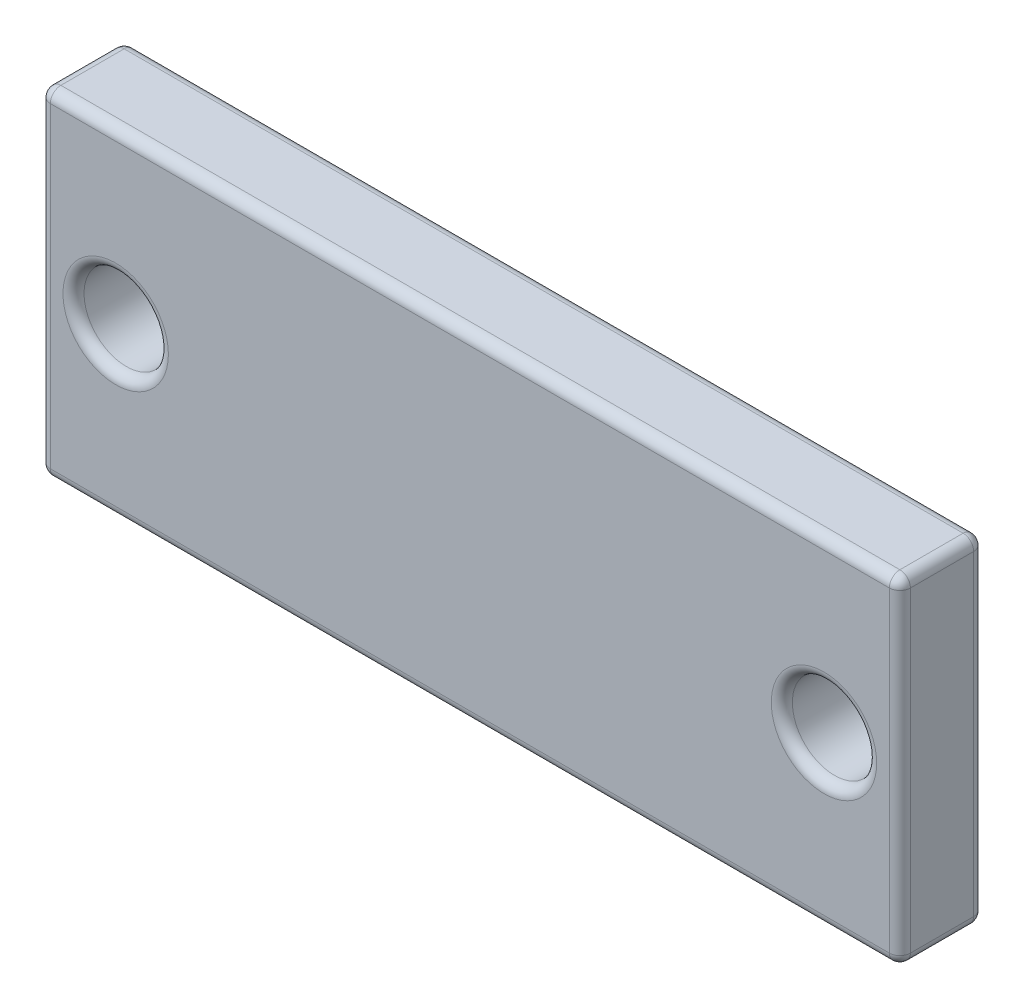
ISO-10303-21;
HEADER;
FILE_DESCRIPTION(('STEP AP214'),'2;1');
FILE_NAME('part.step','',(''),(''),'','','');
FILE_SCHEMA(('AUTOMOTIVE_DESIGN { 1 0 10303 214 1 1 1 1 }'));
ENDSEC;
DATA;
#1=APPLICATION_CONTEXT('core data for automotive mechanical design processes');
#2=APPLICATION_PROTOCOL_DEFINITION('international standard','automotive_design',2000,#1);
#3=PRODUCT_CONTEXT('',#1,'mechanical');
#4=PRODUCT('Part','Part','',(#3));
#5=PRODUCT_RELATED_PRODUCT_CATEGORY('part','',(#4));
#6=PRODUCT_DEFINITION_FORMATION('','',#4);
#7=PRODUCT_DEFINITION_CONTEXT('part definition',#1,'design');
#8=PRODUCT_DEFINITION('design','',#6,#7);
#9=PRODUCT_DEFINITION_SHAPE('','',#8);
#10=(LENGTH_UNIT() NAMED_UNIT(*) SI_UNIT(.MILLI.,.METRE.));
#11=(NAMED_UNIT(*) PLANE_ANGLE_UNIT() SI_UNIT($,.RADIAN.));
#12=(NAMED_UNIT(*) SI_UNIT($,.STERADIAN.) SOLID_ANGLE_UNIT());
#13=UNCERTAINTY_MEASURE_WITH_UNIT(LENGTH_MEASURE(1.E-05),#10,'distance_accuracy_value','');
#14=(GEOMETRIC_REPRESENTATION_CONTEXT(3) GLOBAL_UNCERTAINTY_ASSIGNED_CONTEXT((#13)) GLOBAL_UNIT_ASSIGNED_CONTEXT((#10,
#11,#12)) REPRESENTATION_CONTEXT('',''));
#15=CARTESIAN_POINT('',(0.,0.,0.));
#16=DIRECTION('',(0.,0.,1.));
#17=DIRECTION('',(1.,0.,0.));
#18=AXIS2_PLACEMENT_3D('',#15,#16,#17);
#19=CARTESIAN_POINT('',(-32.385,152.4,29.43225));
#20=DIRECTION('',(1.,0.,0.));
#21=DIRECTION('',(0.,0.,-1.));
#22=AXIS2_PLACEMENT_3D('',#19,#20,#21);
#23=PLANE('',#22);
#24=DIRECTION('',(0.,0.,-1.));
#25=VECTOR('',#24,1.);
#26=CARTESIAN_POINT('',(-32.385,151.60625,29.43225));
#27=LINE('',#26,#25);
#28=CARTESIAN_POINT('',(-32.385,151.60625,28.6385));
#29=VERTEX_POINT('',#28);
#30=CARTESIAN_POINT('',(-32.385,151.60625,23.876));
#31=VERTEX_POINT('',#30);
#32=EDGE_CURVE('E199',#29,#31,#27,.T.);
#33=ORIENTED_EDGE('',*,*,#32,.T.);
#34=DIRECTION('',(0.,-1.,0.));
#35=VECTOR('',#34,1.);
#36=CARTESIAN_POINT('',(-32.385,152.4,23.876));
#37=LINE('',#36,#35);
#38=CARTESIAN_POINT('',(-32.385,127.79375,23.876));
#39=VERTEX_POINT('',#38);
#40=EDGE_CURVE('E134',#31,#39,#37,.T.);
#41=ORIENTED_EDGE('',*,*,#40,.T.);
#42=DIRECTION('',(0.,0.,-1.));
#43=VECTOR('',#42,1.);
#44=CARTESIAN_POINT('',(-32.385,127.79375,29.43225));
#45=LINE('',#44,#43);
#46=CARTESIAN_POINT('',(-32.385,127.79375,28.6385));
#47=VERTEX_POINT('',#46);
#48=EDGE_CURVE('E197',#39,#47,#45,.F.);
#49=ORIENTED_EDGE('',*,*,#48,.T.);
#50=DIRECTION('',(0.,-1.,0.));
#51=VECTOR('',#50,1.);
#52=CARTESIAN_POINT('',(-32.385,152.4,28.6385));
#53=LINE('',#52,#51);
#54=EDGE_CURVE('E195',#47,#29,#53,.F.);
#55=ORIENTED_EDGE('',*,*,#54,.T.);
#56=EDGE_LOOP('',(#33,#41,#49,#55));
#57=FACE_BOUND('',#56,.T.);
#58=ADVANCED_FACE('F36',(#57),#23,.F.);
#59=CARTESIAN_POINT('',(-32.385,127.,29.43225));
#60=DIRECTION('',(0.,1.,0.));
#61=DIRECTION('',(0.,0.,1.));
#62=AXIS2_PLACEMENT_3D('',#59,#60,#61);
#63=PLANE('',#62);
#64=DIRECTION('',(1.,0.,0.));
#65=VECTOR('',#64,1.);
#66=CARTESIAN_POINT('',(-32.385,127.,23.876));
#67=LINE('',#66,#65);
#68=CARTESIAN_POINT('',(-31.59125,127.,23.876));
#69=VERTEX_POINT('',#68);
#70=CARTESIAN_POINT('',(31.59125,127.,23.876));
#71=VERTEX_POINT('',#70);
#72=EDGE_CURVE('E206',#69,#71,#67,.T.);
#73=ORIENTED_EDGE('',*,*,#72,.T.);
#74=DIRECTION('',(0.,0.,-1.));
#75=VECTOR('',#74,1.);
#76=CARTESIAN_POINT('',(31.59125,127.,29.43225));
#77=LINE('',#76,#75);
#78=CARTESIAN_POINT('',(31.59125,127.,28.6385));
#79=VERTEX_POINT('',#78);
#80=EDGE_CURVE('E209',#71,#79,#77,.F.);
#81=ORIENTED_EDGE('',*,*,#80,.T.);
#82=DIRECTION('',(1.,0.,0.));
#83=VECTOR('',#82,1.);
#84=CARTESIAN_POINT('',(-32.385,127.,28.6385));
#85=LINE('',#84,#83);
#86=CARTESIAN_POINT('',(-31.59125,127.,28.6385));
#87=VERTEX_POINT('',#86);
#88=EDGE_CURVE('E204',#79,#87,#85,.F.);
#89=ORIENTED_EDGE('',*,*,#88,.T.);
#90=DIRECTION('',(0.,0.,-1.));
#91=VECTOR('',#90,1.);
#92=CARTESIAN_POINT('',(-31.59125,127.,29.43225));
#93=LINE('',#92,#91);
#94=EDGE_CURVE('E202',#87,#69,#93,.T.);
#95=ORIENTED_EDGE('',*,*,#94,.T.);
#96=EDGE_LOOP('',(#73,#81,#89,#95));
#97=FACE_BOUND('',#96,.T.);
#98=ADVANCED_FACE('F343',(#97),#63,.F.);
#99=CARTESIAN_POINT('',(32.385,127.,29.43225));
#100=DIRECTION('',(-1.,0.,0.));
#101=DIRECTION('',(0.,0.,1.));
#102=AXIS2_PLACEMENT_3D('',#99,#100,#101);
#103=PLANE('',#102);
#104=DIRECTION('',(0.,1.,0.));
#105=VECTOR('',#104,1.);
#106=CARTESIAN_POINT('',(32.385,127.,23.876));
#107=LINE('',#106,#105);
#108=CARTESIAN_POINT('',(32.385,127.79375,23.876));
#109=VERTEX_POINT('',#108);
#110=CARTESIAN_POINT('',(32.385,151.60625,23.876));
#111=VERTEX_POINT('',#110);
#112=EDGE_CURVE('E215',#109,#111,#107,.T.);
#113=ORIENTED_EDGE('',*,*,#112,.T.);
#114=DIRECTION('',(0.,0.,-1.));
#115=VECTOR('',#114,1.);
#116=CARTESIAN_POINT('',(32.385,151.60625,29.43225));
#117=LINE('',#116,#115);
#118=CARTESIAN_POINT('',(32.385,151.60625,28.6385));
#119=VERTEX_POINT('',#118);
#120=EDGE_CURVE('E218',#111,#119,#117,.F.);
#121=ORIENTED_EDGE('',*,*,#120,.T.);
#122=DIRECTION('',(0.,1.,0.));
#123=VECTOR('',#122,1.);
#124=CARTESIAN_POINT('',(32.385,127.,28.6385));
#125=LINE('',#124,#123);
#126=CARTESIAN_POINT('',(32.385,127.79375,28.6385));
#127=VERTEX_POINT('',#126);
#128=EDGE_CURVE('E213',#119,#127,#125,.F.);
#129=ORIENTED_EDGE('',*,*,#128,.T.);
#130=DIRECTION('',(0.,0.,-1.));
#131=VECTOR('',#130,1.);
#132=CARTESIAN_POINT('',(32.385,127.79375,29.43225));
#133=LINE('',#132,#131);
#134=EDGE_CURVE('E211',#127,#109,#133,.T.);
#135=ORIENTED_EDGE('',*,*,#134,.T.);
#136=EDGE_LOOP('',(#113,#121,#129,#135));
#137=FACE_BOUND('',#136,.T.);
#138=ADVANCED_FACE('F324',(#137),#103,.F.);
#139=CARTESIAN_POINT('',(32.385,152.4,29.43225));
#140=DIRECTION('',(0.,-1.,0.));
#141=DIRECTION('',(0.,0.,-1.));
#142=AXIS2_PLACEMENT_3D('',#139,#140,#141);
#143=PLANE('',#142);
#144=DIRECTION('',(-1.,0.,0.));
#145=VECTOR('',#144,1.);
#146=CARTESIAN_POINT('',(32.385,152.4,23.876));
#147=LINE('',#146,#145);
#148=CARTESIAN_POINT('',(31.59125,152.4,23.876));
#149=VERTEX_POINT('',#148);
#150=CARTESIAN_POINT('',(-31.59125,152.4,23.876));
#151=VERTEX_POINT('',#150);
#152=EDGE_CURVE('E45',#149,#151,#147,.T.);
#153=ORIENTED_EDGE('',*,*,#152,.T.);
#154=DIRECTION('',(0.,0.,-1.));
#155=VECTOR('',#154,1.);
#156=CARTESIAN_POINT('',(-31.59125,152.4,29.43225));
#157=LINE('',#156,#155);
#158=CARTESIAN_POINT('',(-31.59125,152.4,28.6385));
#159=VERTEX_POINT('',#158);
#160=EDGE_CURVE('E11',#151,#159,#157,.F.);
#161=ORIENTED_EDGE('',*,*,#160,.T.);
#162=DIRECTION('',(-1.,0.,0.));
#163=VECTOR('',#162,1.);
#164=CARTESIAN_POINT('',(32.385,152.4,28.6385));
#165=LINE('',#164,#163);
#166=CARTESIAN_POINT('',(31.59125,152.4,28.6385));
#167=VERTEX_POINT('',#166);
#168=EDGE_CURVE('E222',#159,#167,#165,.F.);
#169=ORIENTED_EDGE('',*,*,#168,.T.);
#170=DIRECTION('',(0.,0.,-1.));
#171=VECTOR('',#170,1.);
#172=CARTESIAN_POINT('',(31.59125,152.4,29.43225));
#173=LINE('',#172,#171);
#174=EDGE_CURVE('E220',#167,#149,#173,.T.);
#175=ORIENTED_EDGE('',*,*,#174,.T.);
#176=EDGE_LOOP('',(#153,#161,#169,#175));
#177=FACE_BOUND('',#176,.T.);
#178=ADVANCED_FACE('F294',(#177),#143,.F.);
#179=CARTESIAN_POINT('',(0.,0.,29.43225));
#180=DIRECTION('',(0.,0.,1.));
#181=DIRECTION('',(1.,0.,0.));
#182=AXIS2_PLACEMENT_3D('',#179,#180,#181);
#183=PLANE('',#182);
#184=CARTESIAN_POINT('',(-26.67,139.7,29.43225));
#185=DIRECTION('',(0.,0.,1.));
#186=DIRECTION('',(1.,0.,0.));
#187=AXIS2_PLACEMENT_3D('',#184,#185,#186);
#188=CIRCLE('',#187,3.96875);
#189=CARTESIAN_POINT('',(-22.70125,139.7,29.43225));
#190=VERTEX_POINT('',#189);
#191=EDGE_CURVE('E186',#190,#190,#188,.F.);
#192=ORIENTED_EDGE('',*,*,#191,.T.);
#193=EDGE_LOOP('',(#192));
#194=FACE_BOUND('',#193,.T.);
#195=CARTESIAN_POINT('',(26.67,139.7,29.43225));
#196=DIRECTION('',(0.,0.,1.));
#197=DIRECTION('',(1.,0.,0.));
#198=AXIS2_PLACEMENT_3D('',#195,#196,#197);
#199=CIRCLE('',#198,3.96875);
#200=CARTESIAN_POINT('',(30.63875,139.7,29.43225));
#201=VERTEX_POINT('',#200);
#202=EDGE_CURVE('E183',#201,#201,#199,.F.);
#203=ORIENTED_EDGE('',*,*,#202,.T.);
#204=EDGE_LOOP('',(#203));
#205=FACE_BOUND('',#204,.T.);
#206=DIRECTION('',(0.,-1.,0.));
#207=VECTOR('',#206,1.);
#208=CARTESIAN_POINT('',(-31.59125,127.,29.43225));
#209=LINE('',#208,#207);
#210=CARTESIAN_POINT('',(-31.59125,151.60625,29.43225));
#211=VERTEX_POINT('',#210);
#212=CARTESIAN_POINT('',(-31.59125,127.79375,29.43225));
#213=VERTEX_POINT('',#212);
#214=EDGE_CURVE('E174',#211,#213,#209,.T.);
#215=ORIENTED_EDGE('',*,*,#214,.T.);
#216=DIRECTION('',(1.,0.,0.));
#217=VECTOR('',#216,1.);
#218=CARTESIAN_POINT('',(32.385,127.79375,29.43225));
#219=LINE('',#218,#217);
#220=CARTESIAN_POINT('',(31.59125,127.79375,29.43225));
#221=VERTEX_POINT('',#220);
#222=EDGE_CURVE('E180',#213,#221,#219,.T.);
#223=ORIENTED_EDGE('',*,*,#222,.T.);
#224=DIRECTION('',(0.,1.,0.));
#225=VECTOR('',#224,1.);
#226=CARTESIAN_POINT('',(31.59125,152.4,29.43225));
#227=LINE('',#226,#225);
#228=CARTESIAN_POINT('',(31.59125,151.60625,29.43225));
#229=VERTEX_POINT('',#228);
#230=EDGE_CURVE('E178',#221,#229,#227,.T.);
#231=ORIENTED_EDGE('',*,*,#230,.T.);
#232=DIRECTION('',(-1.,0.,0.));
#233=VECTOR('',#232,1.);
#234=CARTESIAN_POINT('',(-32.385,151.60625,29.43225));
#235=LINE('',#234,#233);
#236=EDGE_CURVE('E176',#229,#211,#235,.T.);
#237=ORIENTED_EDGE('',*,*,#236,.T.);
#238=EDGE_LOOP('',(#215,#223,#231,#237));
#239=FACE_BOUND('',#238,.T.);
#240=ADVANCED_FACE('F300',(#194,#205,#239),#183,.T.);
#241=CARTESIAN_POINT('',(0.,0.,23.08225));
#242=DIRECTION('',(0.,0.,1.));
#243=DIRECTION('',(1.,0.,0.));
#244=AXIS2_PLACEMENT_3D('',#241,#242,#243);
#245=PLANE('',#244);
#246=CARTESIAN_POINT('',(-26.67,139.7,23.08225));
#247=DIRECTION('',(0.,0.,1.));
#248=DIRECTION('',(1.,0.,0.));
#249=AXIS2_PLACEMENT_3D('',#246,#247,#248);
#250=CIRCLE('',#249,3.96875);
#251=CARTESIAN_POINT('',(-22.70125,139.7,23.08225));
#252=VERTEX_POINT('',#251);
#253=EDGE_CURVE('E161',#252,#252,#250,.T.);
#254=ORIENTED_EDGE('',*,*,#253,.T.);
#255=EDGE_LOOP('',(#254));
#256=FACE_BOUND('',#255,.T.);
#257=CARTESIAN_POINT('',(26.67,139.7,23.08225));
#258=DIRECTION('',(0.,0.,1.));
#259=DIRECTION('',(1.,0.,0.));
#260=AXIS2_PLACEMENT_3D('',#257,#258,#259);
#261=CIRCLE('',#260,3.96875);
#262=CARTESIAN_POINT('',(30.63875,139.7,23.08225));
#263=VERTEX_POINT('',#262);
#264=EDGE_CURVE('E158',#263,#263,#261,.T.);
#265=ORIENTED_EDGE('',*,*,#264,.T.);
#266=EDGE_LOOP('',(#265));
#267=FACE_BOUND('',#266,.T.);
#268=DIRECTION('',(1.,0.,0.));
#269=VECTOR('',#268,1.);
#270=CARTESIAN_POINT('',(0.,127.79375,23.08225));
#271=LINE('',#270,#269);
#272=CARTESIAN_POINT('',(31.59125,127.79375,23.08225));
#273=VERTEX_POINT('',#272);
#274=CARTESIAN_POINT('',(-31.59125,127.79375,23.08225));
#275=VERTEX_POINT('',#274);
#276=EDGE_CURVE('E156',#273,#275,#271,.F.);
#277=ORIENTED_EDGE('',*,*,#276,.T.);
#278=DIRECTION('',(0.,-1.,0.));
#279=VECTOR('',#278,1.);
#280=CARTESIAN_POINT('',(-31.59125,0.,23.08225));
#281=LINE('',#280,#279);
#282=CARTESIAN_POINT('',(-31.59125,151.60625,23.08225));
#283=VERTEX_POINT('',#282);
#284=EDGE_CURVE('E131',#275,#283,#281,.F.);
#285=ORIENTED_EDGE('',*,*,#284,.T.);
#286=DIRECTION('',(-1.,0.,0.));
#287=VECTOR('',#286,1.);
#288=CARTESIAN_POINT('',(0.,151.60625,23.08225));
#289=LINE('',#288,#287);
#290=CARTESIAN_POINT('',(31.59125,151.60625,23.08225));
#291=VERTEX_POINT('',#290);
#292=EDGE_CURVE('E146',#283,#291,#289,.F.);
#293=ORIENTED_EDGE('',*,*,#292,.T.);
#294=DIRECTION('',(0.,1.,0.));
#295=VECTOR('',#294,1.);
#296=CARTESIAN_POINT('',(31.59125,0.,23.08225));
#297=LINE('',#296,#295);
#298=EDGE_CURVE('E152',#291,#273,#297,.F.);
#299=ORIENTED_EDGE('',*,*,#298,.T.);
#300=EDGE_LOOP('',(#277,#285,#293,#299));
#301=FACE_BOUND('',#300,.T.);
#302=ADVANCED_FACE('F154',(#256,#267,#301),#245,.F.);
#303=CARTESIAN_POINT('',(-26.67,139.7,31.75));
#304=DIRECTION('',(0.,0.,-1.));
#305=DIRECTION('',(-1.,0.,0.));
#306=AXIS2_PLACEMENT_3D('',#303,#304,#305);
#307=CYLINDRICAL_SURFACE('',#306,3.175);
#308=CARTESIAN_POINT('',(-26.67,139.7,23.876));
#309=DIRECTION('',(0.,0.,1.));
#310=DIRECTION('',(1.,0.,0.));
#311=AXIS2_PLACEMENT_3D('',#308,#309,#310);
#312=CIRCLE('',#311,3.175);
#313=CARTESIAN_POINT('',(-23.495,139.7,23.876));
#314=VERTEX_POINT('',#313);
#315=EDGE_CURVE('E171',#314,#314,#312,.F.);
#316=ORIENTED_EDGE('',*,*,#315,.T.);
#317=EDGE_LOOP('',(#316));
#318=FACE_BOUND('',#317,.T.);
#319=CARTESIAN_POINT('',(-26.67,139.7,28.6385));
#320=DIRECTION('',(0.,0.,1.));
#321=DIRECTION('',(1.,0.,0.));
#322=AXIS2_PLACEMENT_3D('',#319,#320,#321);
#323=CIRCLE('',#322,3.175);
#324=CARTESIAN_POINT('',(-23.495,139.7,28.6385));
#325=VERTEX_POINT('',#324);
#326=EDGE_CURVE('E168',#325,#325,#323,.T.);
#327=ORIENTED_EDGE('',*,*,#326,.T.);
#328=EDGE_LOOP('',(#327));
#329=FACE_BOUND('',#328,.T.);
#330=ADVANCED_FACE('F517',(#318,#329),#307,.F.);
#331=CARTESIAN_POINT('',(26.67,139.7,31.75));
#332=DIRECTION('',(0.,0.,-1.));
#333=DIRECTION('',(-1.,0.,0.));
#334=AXIS2_PLACEMENT_3D('',#331,#332,#333);
#335=CYLINDRICAL_SURFACE('',#334,3.175);
#336=CARTESIAN_POINT('',(26.67,139.7,23.876));
#337=DIRECTION('',(0.,0.,1.));
#338=DIRECTION('',(1.,0.,0.));
#339=AXIS2_PLACEMENT_3D('',#336,#337,#338);
#340=CIRCLE('',#339,3.175);
#341=CARTESIAN_POINT('',(29.845,139.7,23.876));
#342=VERTEX_POINT('',#341);
#343=EDGE_CURVE('E192',#342,#342,#340,.F.);
#344=ORIENTED_EDGE('',*,*,#343,.T.);
#345=EDGE_LOOP('',(#344));
#346=FACE_BOUND('',#345,.T.);
#347=CARTESIAN_POINT('',(26.67,139.7,28.6385));
#348=DIRECTION('',(0.,0.,1.));
#349=DIRECTION('',(1.,0.,0.));
#350=AXIS2_PLACEMENT_3D('',#347,#348,#349);
#351=CIRCLE('',#350,3.175);
#352=CARTESIAN_POINT('',(29.845,139.7,28.6385));
#353=VERTEX_POINT('',#352);
#354=EDGE_CURVE('E189',#353,#353,#351,.T.);
#355=ORIENTED_EDGE('',*,*,#354,.T.);
#356=EDGE_LOOP('',(#355));
#357=FACE_BOUND('',#356,.T.);
#358=ADVANCED_FACE('F357',(#346,#357),#335,.F.);
#359=CARTESIAN_POINT('',(-26.67,139.7,23.876));
#360=DIRECTION('',(0.,0.,1.));
#361=DIRECTION('',(1.,0.,0.));
#362=AXIS2_PLACEMENT_3D('',#359,#360,#361);
#363=TOROIDAL_SURFACE('',#362,3.96875,0.79375);
#364=ORIENTED_EDGE('',*,*,#315,.F.);
#365=EDGE_LOOP('',(#364));
#366=FACE_BOUND('',#365,.T.);
#367=ORIENTED_EDGE('',*,*,#253,.F.);
#368=EDGE_LOOP('',(#367));
#369=FACE_BOUND('',#368,.T.);
#370=ADVANCED_FACE('F353',(#366,#369),#363,.T.);
#371=CARTESIAN_POINT('',(-26.67,139.7,28.6385));
#372=DIRECTION('',(0.,0.,1.));
#373=DIRECTION('',(1.,0.,0.));
#374=AXIS2_PLACEMENT_3D('',#371,#372,#373);
#375=TOROIDAL_SURFACE('',#374,3.96875,0.79375);
#376=ORIENTED_EDGE('',*,*,#191,.F.);
#377=EDGE_LOOP('',(#376));
#378=FACE_BOUND('',#377,.T.);
#379=ORIENTED_EDGE('',*,*,#326,.F.);
#380=EDGE_LOOP('',(#379));
#381=FACE_BOUND('',#380,.T.);
#382=ADVANCED_FACE('F356',(#378,#381),#375,.T.);
#383=CARTESIAN_POINT('',(26.67,139.7,23.876));
#384=DIRECTION('',(0.,0.,1.));
#385=DIRECTION('',(1.,0.,0.));
#386=AXIS2_PLACEMENT_3D('',#383,#384,#385);
#387=TOROIDAL_SURFACE('',#386,3.96875,0.79375);
#388=ORIENTED_EDGE('',*,*,#343,.F.);
#389=EDGE_LOOP('',(#388));
#390=FACE_BOUND('',#389,.T.);
#391=ORIENTED_EDGE('',*,*,#264,.F.);
#392=EDGE_LOOP('',(#391));
#393=FACE_BOUND('',#392,.T.);
#394=ADVANCED_FACE('F361',(#390,#393),#387,.T.);
#395=CARTESIAN_POINT('',(26.67,139.7,28.6385));
#396=DIRECTION('',(0.,0.,1.));
#397=DIRECTION('',(1.,0.,0.));
#398=AXIS2_PLACEMENT_3D('',#395,#396,#397);
#399=TOROIDAL_SURFACE('',#398,3.96875,0.79375);
#400=ORIENTED_EDGE('',*,*,#202,.F.);
#401=EDGE_LOOP('',(#400));
#402=FACE_BOUND('',#401,.T.);
#403=ORIENTED_EDGE('',*,*,#354,.F.);
#404=EDGE_LOOP('',(#403));
#405=FACE_BOUND('',#404,.T.);
#406=ADVANCED_FACE('F365',(#402,#405),#399,.T.);
#407=CARTESIAN_POINT('',(31.59125,0.,28.6385));
#408=DIRECTION('',(0.,-1.,0.));
#409=DIRECTION('',(0.,0.,-1.));
#410=AXIS2_PLACEMENT_3D('',#407,#408,#409);
#411=CYLINDRICAL_SURFACE('',#410,0.79375);
#412=CARTESIAN_POINT('',(31.59125,151.60625,28.6385));
#413=DIRECTION('',(0.,1.,0.));
#414=DIRECTION('',(0.,0.,1.));
#415=AXIS2_PLACEMENT_3D('',#412,#413,#414);
#416=CIRCLE('',#415,0.79375);
#417=EDGE_CURVE('E40',#229,#119,#416,.T.);
#418=ORIENTED_EDGE('',*,*,#417,.F.);
#419=ORIENTED_EDGE('',*,*,#230,.F.);
#420=CARTESIAN_POINT('',(31.59125,127.79375,28.6385));
#421=DIRECTION('',(0.,-1.,0.));
#422=DIRECTION('',(0.,0.,-1.));
#423=AXIS2_PLACEMENT_3D('',#420,#421,#422);
#424=CIRCLE('',#423,0.79375);
#425=EDGE_CURVE('E273',#127,#221,#424,.T.);
#426=ORIENTED_EDGE('',*,*,#425,.F.);
#427=ORIENTED_EDGE('',*,*,#128,.F.);
#428=EDGE_LOOP('',(#418,#419,#426,#427));
#429=FACE_BOUND('',#428,.T.);
#430=ADVANCED_FACE('F38',(#429),#411,.T.);
#431=CARTESIAN_POINT('',(31.59125,151.60625,28.6385));
#432=DIRECTION('',(1.,0.,0.));
#433=DIRECTION('',(0.,0.,-1.));
#434=AXIS2_PLACEMENT_3D('',#431,#432,#433);
#435=SPHERICAL_SURFACE('',#434,0.79375);
#436=CARTESIAN_POINT('',(31.59125,151.60625,28.6385));
#437=DIRECTION('',(1.,0.,0.));
#438=DIRECTION('',(0.,0.,-1.));
#439=AXIS2_PLACEMENT_3D('',#436,#437,#438);
#440=CIRCLE('',#439,0.79375);
#441=EDGE_CURVE('E268',#229,#167,#440,.F.);
#442=ORIENTED_EDGE('',*,*,#441,.F.);
#443=ORIENTED_EDGE('',*,*,#417,.T.);
#444=CARTESIAN_POINT('',(31.59125,151.60625,28.6385));
#445=DIRECTION('',(0.,0.,1.));
#446=DIRECTION('',(1.,0.,0.));
#447=AXIS2_PLACEMENT_3D('',#444,#445,#446);
#448=CIRCLE('',#447,0.79375);
#449=EDGE_CURVE('E271',#167,#119,#448,.F.);
#450=ORIENTED_EDGE('',*,*,#449,.F.);
#451=EDGE_LOOP('',(#442,#443,#450));
#452=FACE_BOUND('',#451,.T.);
#453=ADVANCED_FACE('F285',(#452),#435,.T.);
#454=CARTESIAN_POINT('',(31.59125,127.79375,28.6385));
#455=DIRECTION('',(0.,0.,1.));
#456=DIRECTION('',(1.,0.,0.));
#457=AXIS2_PLACEMENT_3D('',#454,#455,#456);
#458=SPHERICAL_SURFACE('',#457,0.79375);
#459=CARTESIAN_POINT('',(31.59125,127.79375,28.6385));
#460=DIRECTION('',(0.,0.,1.));
#461=DIRECTION('',(1.,0.,0.));
#462=AXIS2_PLACEMENT_3D('',#459,#460,#461);
#463=CIRCLE('',#462,0.79375);
#464=EDGE_CURVE('E263',#127,#79,#463,.F.);
#465=ORIENTED_EDGE('',*,*,#464,.F.);
#466=ORIENTED_EDGE('',*,*,#425,.T.);
#467=CARTESIAN_POINT('',(31.59125,127.79375,28.6385));
#468=DIRECTION('',(1.,0.,0.));
#469=DIRECTION('',(0.,0.,-1.));
#470=AXIS2_PLACEMENT_3D('',#467,#468,#469);
#471=CIRCLE('',#470,0.79375);
#472=EDGE_CURVE('E266',#79,#221,#471,.F.);
#473=ORIENTED_EDGE('',*,*,#472,.F.);
#474=EDGE_LOOP('',(#465,#466,#473));
#475=FACE_BOUND('',#474,.T.);
#476=ADVANCED_FACE('F316',(#475),#458,.T.);
#477=CARTESIAN_POINT('',(31.59125,151.60625,29.43225));
#478=DIRECTION('',(0.,0.,-1.));
#479=DIRECTION('',(-1.,0.,0.));
#480=AXIS2_PLACEMENT_3D('',#477,#478,#479);
#481=CYLINDRICAL_SURFACE('',#480,0.79375);
#482=ORIENTED_EDGE('',*,*,#449,.T.);
#483=ORIENTED_EDGE('',*,*,#120,.F.);
#484=CARTESIAN_POINT('',(31.59125,151.60625,23.876));
#485=DIRECTION('',(0.,0.,-1.));
#486=DIRECTION('',(-1.,0.,0.));
#487=AXIS2_PLACEMENT_3D('',#484,#485,#486);
#488=CIRCLE('',#487,0.79375);
#489=EDGE_CURVE('E258',#149,#111,#488,.T.);
#490=ORIENTED_EDGE('',*,*,#489,.F.);
#491=ORIENTED_EDGE('',*,*,#174,.F.);
#492=EDGE_LOOP('',(#482,#483,#490,#491));
#493=FACE_BOUND('',#492,.T.);
#494=ADVANCED_FACE('F292',(#493),#481,.T.);
#495=CARTESIAN_POINT('',(0.,151.60625,28.6385));
#496=DIRECTION('',(1.,0.,0.));
#497=DIRECTION('',(0.,0.,-1.));
#498=AXIS2_PLACEMENT_3D('',#495,#496,#497);
#499=CYLINDRICAL_SURFACE('',#498,0.79375);
#500=ORIENTED_EDGE('',*,*,#441,.T.);
#501=ORIENTED_EDGE('',*,*,#168,.F.);
#502=CARTESIAN_POINT('',(-31.59125,151.60625,28.6385));
#503=DIRECTION('',(-1.,0.,0.));
#504=DIRECTION('',(0.,0.,1.));
#505=AXIS2_PLACEMENT_3D('',#502,#503,#504);
#506=CIRCLE('',#505,0.79375);
#507=EDGE_CURVE('E255',#211,#159,#506,.T.);
#508=ORIENTED_EDGE('',*,*,#507,.F.);
#509=ORIENTED_EDGE('',*,*,#236,.F.);
#510=EDGE_LOOP('',(#500,#501,#508,#509));
#511=FACE_BOUND('',#510,.T.);
#512=ADVANCED_FACE('F297',(#511),#499,.T.);
#513=CARTESIAN_POINT('',(-31.59125,0.,28.6385));
#514=DIRECTION('',(0.,1.,0.));
#515=DIRECTION('',(0.,0.,1.));
#516=AXIS2_PLACEMENT_3D('',#513,#514,#515);
#517=CYLINDRICAL_SURFACE('',#516,0.79375);
#518=CARTESIAN_POINT('',(-31.59125,127.79375,28.6385));
#519=DIRECTION('',(0.,-1.,0.));
#520=DIRECTION('',(0.,0.,-1.));
#521=AXIS2_PLACEMENT_3D('',#518,#519,#520);
#522=CIRCLE('',#521,0.79375);
#523=EDGE_CURVE('E249',#213,#47,#522,.T.);
#524=ORIENTED_EDGE('',*,*,#523,.F.);
#525=ORIENTED_EDGE('',*,*,#214,.F.);
#526=CARTESIAN_POINT('',(-31.59125,151.60625,28.6385));
#527=DIRECTION('',(0.,1.,0.));
#528=DIRECTION('',(0.,0.,1.));
#529=AXIS2_PLACEMENT_3D('',#526,#527,#528);
#530=CIRCLE('',#529,0.79375);
#531=EDGE_CURVE('E252',#29,#211,#530,.T.);
#532=ORIENTED_EDGE('',*,*,#531,.F.);
#533=ORIENTED_EDGE('',*,*,#54,.F.);
#534=EDGE_LOOP('',(#524,#525,#532,#533));
#535=FACE_BOUND('',#534,.T.);
#536=ADVANCED_FACE('F305',(#535),#517,.T.);
#537=CARTESIAN_POINT('',(0.,127.79375,28.6385));
#538=DIRECTION('',(-1.,0.,0.));
#539=DIRECTION('',(0.,0.,1.));
#540=AXIS2_PLACEMENT_3D('',#537,#538,#539);
#541=CYLINDRICAL_SURFACE('',#540,0.79375);
#542=ORIENTED_EDGE('',*,*,#472,.T.);
#543=ORIENTED_EDGE('',*,*,#222,.F.);
#544=CARTESIAN_POINT('',(-31.59125,127.79375,28.6385));
#545=DIRECTION('',(-1.,0.,0.));
#546=DIRECTION('',(0.,0.,1.));
#547=AXIS2_PLACEMENT_3D('',#544,#545,#546);
#548=CIRCLE('',#547,0.79375);
#549=EDGE_CURVE('E246',#87,#213,#548,.T.);
#550=ORIENTED_EDGE('',*,*,#549,.F.);
#551=ORIENTED_EDGE('',*,*,#88,.F.);
#552=EDGE_LOOP('',(#542,#543,#550,#551));
#553=FACE_BOUND('',#552,.T.);
#554=ADVANCED_FACE('F315',(#553),#541,.T.);
#555=CARTESIAN_POINT('',(31.59125,127.79375,29.43225));
#556=DIRECTION('',(0.,0.,-1.));
#557=DIRECTION('',(-1.,0.,0.));
#558=AXIS2_PLACEMENT_3D('',#555,#556,#557);
#559=CYLINDRICAL_SURFACE('',#558,0.79375);
#560=ORIENTED_EDGE('',*,*,#464,.T.);
#561=ORIENTED_EDGE('',*,*,#80,.F.);
#562=CARTESIAN_POINT('',(31.59125,127.79375,23.876));
#563=DIRECTION('',(0.,0.,-1.));
#564=DIRECTION('',(-1.,0.,0.));
#565=AXIS2_PLACEMENT_3D('',#562,#563,#564);
#566=CIRCLE('',#565,0.79375);
#567=EDGE_CURVE('E243',#109,#71,#566,.T.);
#568=ORIENTED_EDGE('',*,*,#567,.F.);
#569=ORIENTED_EDGE('',*,*,#134,.F.);
#570=EDGE_LOOP('',(#560,#561,#568,#569));
#571=FACE_BOUND('',#570,.T.);
#572=ADVANCED_FACE('F321',(#571),#559,.T.);
#573=CARTESIAN_POINT('',(31.59125,127.,23.876));
#574=DIRECTION('',(0.,1.,0.));
#575=DIRECTION('',(0.,0.,1.));
#576=AXIS2_PLACEMENT_3D('',#573,#574,#575);
#577=CYLINDRICAL_SURFACE('',#576,0.79375);
#578=CARTESIAN_POINT('',(31.59125,151.60625,23.876));
#579=DIRECTION('',(0.,1.,0.));
#580=DIRECTION('',(0.,0.,1.));
#581=AXIS2_PLACEMENT_3D('',#578,#579,#580);
#582=CIRCLE('',#581,0.79375);
#583=EDGE_CURVE('E260',#111,#291,#582,.T.);
#584=ORIENTED_EDGE('',*,*,#583,.F.);
#585=ORIENTED_EDGE('',*,*,#112,.F.);
#586=CARTESIAN_POINT('',(31.59125,127.79375,23.876));
#587=DIRECTION('',(0.,-1.,0.));
#588=DIRECTION('',(0.,0.,-1.));
#589=AXIS2_PLACEMENT_3D('',#586,#587,#588);
#590=CIRCLE('',#589,0.79375);
#591=EDGE_CURVE('E240',#273,#109,#590,.T.);
#592=ORIENTED_EDGE('',*,*,#591,.F.);
#593=ORIENTED_EDGE('',*,*,#298,.F.);
#594=EDGE_LOOP('',(#584,#585,#592,#593));
#595=FACE_BOUND('',#594,.T.);
#596=ADVANCED_FACE('F328',(#595),#577,.T.);
#597=CARTESIAN_POINT('',(31.59125,151.60625,23.876));
#598=DIRECTION('',(1.,0.,0.));
#599=DIRECTION('',(0.,0.,-1.));
#600=AXIS2_PLACEMENT_3D('',#597,#598,#599);
#601=SPHERICAL_SURFACE('',#600,0.79375);
#602=ORIENTED_EDGE('',*,*,#489,.T.);
#603=ORIENTED_EDGE('',*,*,#583,.T.);
#604=CARTESIAN_POINT('',(31.59125,151.60625,23.876));
#605=DIRECTION('',(1.,0.,0.));
#606=DIRECTION('',(0.,0.,-1.));
#607=AXIS2_PLACEMENT_3D('',#604,#605,#606);
#608=CIRCLE('',#607,0.79375);
#609=EDGE_CURVE('E149',#149,#291,#608,.F.);
#610=ORIENTED_EDGE('',*,*,#609,.F.);
#611=EDGE_LOOP('',(#602,#603,#610));
#612=FACE_BOUND('',#611,.T.);
#613=ADVANCED_FACE('F331',(#612),#601,.T.);
#614=CARTESIAN_POINT('',(-31.59125,151.60625,28.6385));
#615=DIRECTION('',(0.,0.,1.));
#616=DIRECTION('',(1.,0.,0.));
#617=AXIS2_PLACEMENT_3D('',#614,#615,#616);
#618=SPHERICAL_SURFACE('',#617,0.79375);
#619=ORIENTED_EDGE('',*,*,#531,.T.);
#620=ORIENTED_EDGE('',*,*,#507,.T.);
#621=CARTESIAN_POINT('',(-31.59125,151.60625,28.6385));
#622=DIRECTION('',(0.,0.,1.));
#623=DIRECTION('',(1.,0.,0.));
#624=AXIS2_PLACEMENT_3D('',#621,#622,#623);
#625=CIRCLE('',#624,0.79375);
#626=EDGE_CURVE('E236',#29,#159,#625,.F.);
#627=ORIENTED_EDGE('',*,*,#626,.F.);
#628=EDGE_LOOP('',(#619,#620,#627));
#629=FACE_BOUND('',#628,.T.);
#630=ADVANCED_FACE('F333',(#629),#618,.T.);
#631=CARTESIAN_POINT('',(-31.59125,127.79375,28.6385));
#632=DIRECTION('',(0.,0.,1.));
#633=DIRECTION('',(1.,0.,0.));
#634=AXIS2_PLACEMENT_3D('',#631,#632,#633);
#635=SPHERICAL_SURFACE('',#634,0.79375);
#636=ORIENTED_EDGE('',*,*,#549,.T.);
#637=ORIENTED_EDGE('',*,*,#523,.T.);
#638=CARTESIAN_POINT('',(-31.59125,127.79375,28.6385));
#639=DIRECTION('',(0.,0.,1.));
#640=DIRECTION('',(1.,0.,0.));
#641=AXIS2_PLACEMENT_3D('',#638,#639,#640);
#642=CIRCLE('',#641,0.79375);
#643=EDGE_CURVE('E233',#87,#47,#642,.F.);
#644=ORIENTED_EDGE('',*,*,#643,.F.);
#645=EDGE_LOOP('',(#636,#637,#644));
#646=FACE_BOUND('',#645,.T.);
#647=ADVANCED_FACE('F311',(#646),#635,.T.);
#648=CARTESIAN_POINT('',(31.59125,127.79375,23.876));
#649=DIRECTION('',(1.,0.,0.));
#650=DIRECTION('',(0.,0.,-1.));
#651=AXIS2_PLACEMENT_3D('',#648,#649,#650);
#652=SPHERICAL_SURFACE('',#651,0.79375);
#653=ORIENTED_EDGE('',*,*,#591,.T.);
#654=ORIENTED_EDGE('',*,*,#567,.T.);
#655=CARTESIAN_POINT('',(31.59125,127.79375,23.876));
#656=DIRECTION('',(1.,0.,0.));
#657=DIRECTION('',(0.,0.,-1.));
#658=AXIS2_PLACEMENT_3D('',#655,#656,#657);
#659=CIRCLE('',#658,0.79375);
#660=EDGE_CURVE('E143',#273,#71,#659,.F.);
#661=ORIENTED_EDGE('',*,*,#660,.F.);
#662=EDGE_LOOP('',(#653,#654,#661));
#663=FACE_BOUND('',#662,.T.);
#664=ADVANCED_FACE('F392',(#663),#652,.T.);
#665=CARTESIAN_POINT('',(32.385,151.60625,23.876));
#666=DIRECTION('',(-1.,0.,0.));
#667=DIRECTION('',(0.,0.,1.));
#668=AXIS2_PLACEMENT_3D('',#665,#666,#667);
#669=CYLINDRICAL_SURFACE('',#668,0.79375);
#670=ORIENTED_EDGE('',*,*,#609,.T.);
#671=ORIENTED_EDGE('',*,*,#292,.F.);
#672=CARTESIAN_POINT('',(-31.59125,151.60625,23.876));
#673=DIRECTION('',(-1.,0.,0.));
#674=DIRECTION('',(0.,0.,1.));
#675=AXIS2_PLACEMENT_3D('',#672,#673,#674);
#676=CIRCLE('',#675,0.79375);
#677=EDGE_CURVE('E138',#151,#283,#676,.T.);
#678=ORIENTED_EDGE('',*,*,#677,.F.);
#679=ORIENTED_EDGE('',*,*,#152,.F.);
#680=EDGE_LOOP('',(#670,#671,#678,#679));
#681=FACE_BOUND('',#680,.T.);
#682=ADVANCED_FACE('F147',(#681),#669,.T.);
#683=CARTESIAN_POINT('',(-31.59125,151.60625,29.43225));
#684=DIRECTION('',(0.,0.,-1.));
#685=DIRECTION('',(-1.,0.,0.));
#686=AXIS2_PLACEMENT_3D('',#683,#684,#685);
#687=CYLINDRICAL_SURFACE('',#686,0.79375);
#688=ORIENTED_EDGE('',*,*,#626,.T.);
#689=ORIENTED_EDGE('',*,*,#160,.F.);
#690=CARTESIAN_POINT('',(-31.59125,151.60625,23.876));
#691=DIRECTION('',(0.,0.,-1.));
#692=DIRECTION('',(-1.,0.,0.));
#693=AXIS2_PLACEMENT_3D('',#690,#691,#692);
#694=CIRCLE('',#693,0.79375);
#695=EDGE_CURVE('E53',#31,#151,#694,.T.);
#696=ORIENTED_EDGE('',*,*,#695,.F.);
#697=ORIENTED_EDGE('',*,*,#32,.F.);
#698=EDGE_LOOP('',(#688,#689,#696,#697));
#699=FACE_BOUND('',#698,.T.);
#700=ADVANCED_FACE('F385',(#699),#687,.T.);
#701=CARTESIAN_POINT('',(-31.59125,127.79375,29.43225));
#702=DIRECTION('',(0.,0.,-1.));
#703=DIRECTION('',(-1.,0.,0.));
#704=AXIS2_PLACEMENT_3D('',#701,#702,#703);
#705=CYLINDRICAL_SURFACE('',#704,0.79375);
#706=ORIENTED_EDGE('',*,*,#643,.T.);
#707=ORIENTED_EDGE('',*,*,#48,.F.);
#708=CARTESIAN_POINT('',(-31.59125,127.79375,23.876));
#709=DIRECTION('',(0.,0.,-1.));
#710=DIRECTION('',(-1.,0.,0.));
#711=AXIS2_PLACEMENT_3D('',#708,#709,#710);
#712=CIRCLE('',#711,0.79375);
#713=EDGE_CURVE('E228',#69,#39,#712,.T.);
#714=ORIENTED_EDGE('',*,*,#713,.F.);
#715=ORIENTED_EDGE('',*,*,#94,.F.);
#716=EDGE_LOOP('',(#706,#707,#714,#715));
#717=FACE_BOUND('',#716,.T.);
#718=ADVANCED_FACE('F381',(#717),#705,.T.);
#719=CARTESIAN_POINT('',(-32.385,127.79375,23.876));
#720=DIRECTION('',(1.,0.,0.));
#721=DIRECTION('',(0.,0.,-1.));
#722=AXIS2_PLACEMENT_3D('',#719,#720,#721);
#723=CYLINDRICAL_SURFACE('',#722,0.79375);
#724=ORIENTED_EDGE('',*,*,#660,.T.);
#725=ORIENTED_EDGE('',*,*,#72,.F.);
#726=CARTESIAN_POINT('',(-31.59125,127.79375,23.876));
#727=DIRECTION('',(-1.,0.,0.));
#728=DIRECTION('',(0.,0.,1.));
#729=AXIS2_PLACEMENT_3D('',#726,#727,#728);
#730=CIRCLE('',#729,0.79375);
#731=EDGE_CURVE('E135',#275,#69,#730,.T.);
#732=ORIENTED_EDGE('',*,*,#731,.F.);
#733=ORIENTED_EDGE('',*,*,#276,.F.);
#734=EDGE_LOOP('',(#724,#725,#732,#733));
#735=FACE_BOUND('',#734,.T.);
#736=ADVANCED_FACE('F378',(#735),#723,.T.);
#737=CARTESIAN_POINT('',(-31.59125,151.60625,23.876));
#738=DIRECTION('',(0.,1.,0.));
#739=DIRECTION('',(0.,0.,1.));
#740=AXIS2_PLACEMENT_3D('',#737,#738,#739);
#741=SPHERICAL_SURFACE('',#740,0.79375);
#742=ORIENTED_EDGE('',*,*,#695,.T.);
#743=ORIENTED_EDGE('',*,*,#677,.T.);
#744=CARTESIAN_POINT('',(-31.59125,151.60625,23.876));
#745=DIRECTION('',(0.,1.,0.));
#746=DIRECTION('',(0.,0.,1.));
#747=AXIS2_PLACEMENT_3D('',#744,#745,#746);
#748=CIRCLE('',#747,0.79375);
#749=EDGE_CURVE('E128',#31,#283,#748,.F.);
#750=ORIENTED_EDGE('',*,*,#749,.F.);
#751=EDGE_LOOP('',(#742,#743,#750));
#752=FACE_BOUND('',#751,.T.);
#753=ADVANCED_FACE('F140',(#752),#741,.T.);
#754=CARTESIAN_POINT('',(-31.59125,127.79375,23.876));
#755=DIRECTION('',(0.,-1.,0.));
#756=DIRECTION('',(0.,0.,-1.));
#757=AXIS2_PLACEMENT_3D('',#754,#755,#756);
#758=SPHERICAL_SURFACE('',#757,0.79375);
#759=ORIENTED_EDGE('',*,*,#731,.T.);
#760=ORIENTED_EDGE('',*,*,#713,.T.);
#761=CARTESIAN_POINT('',(-31.59125,127.79375,23.876));
#762=DIRECTION('',(0.,-1.,0.));
#763=DIRECTION('',(0.,0.,-1.));
#764=AXIS2_PLACEMENT_3D('',#761,#762,#763);
#765=CIRCLE('',#764,0.79375);
#766=EDGE_CURVE('E136',#275,#39,#765,.F.);
#767=ORIENTED_EDGE('',*,*,#766,.F.);
#768=EDGE_LOOP('',(#759,#760,#767));
#769=FACE_BOUND('',#768,.T.);
#770=ADVANCED_FACE('F372',(#769),#758,.T.);
#771=CARTESIAN_POINT('',(-31.59125,152.4,23.876));
#772=DIRECTION('',(0.,-1.,0.));
#773=DIRECTION('',(0.,0.,-1.));
#774=AXIS2_PLACEMENT_3D('',#771,#772,#773);
#775=CYLINDRICAL_SURFACE('',#774,0.79375);
#776=ORIENTED_EDGE('',*,*,#749,.T.);
#777=ORIENTED_EDGE('',*,*,#284,.F.);
#778=ORIENTED_EDGE('',*,*,#766,.T.);
#779=ORIENTED_EDGE('',*,*,#40,.F.);
#780=EDGE_LOOP('',(#776,#777,#778,#779));
#781=FACE_BOUND('',#780,.T.);
#782=ADVANCED_FACE('F129',(#781),#775,.T.);
#783=CLOSED_SHELL('',(#58,#98,#138,#178,#240,#302,#330,#358,#370,#382,#394,#406,#430,#453,#476,
#494,#512,#536,#554,#572,#596,#613,#630,#647,#664,#682,#700,#718,#736,#753,#770,#782));
#784=MANIFOLD_SOLID_BREP('B2',#783);
#785=ADVANCED_BREP_SHAPE_REPRESENTATION('',(#18,#784),#14);
#786=SHAPE_DEFINITION_REPRESENTATION(#9,#785);
ENDSEC;
END-ISO-10303-21;
